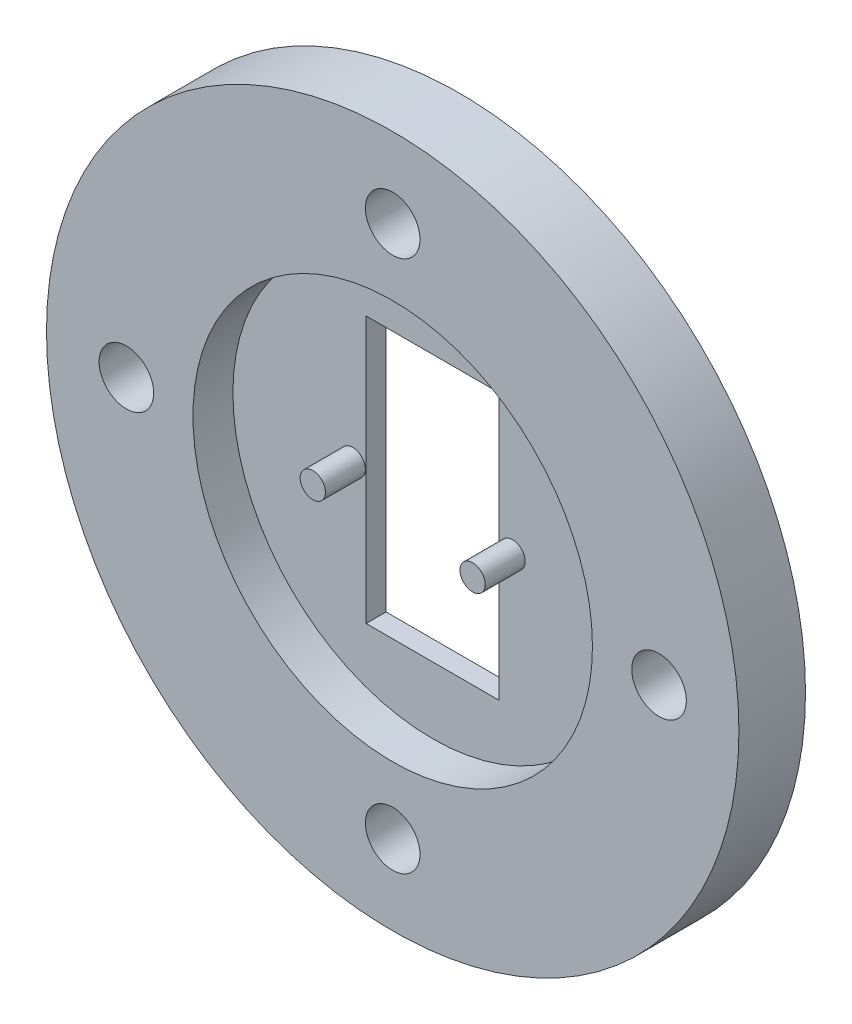
ISO-10303-21;
HEADER;
FILE_DESCRIPTION(('STEP AP214'),'2;1');
FILE_NAME('part.step','',(''),(''),'','','');
FILE_SCHEMA(('AUTOMOTIVE_DESIGN { 1 0 10303 214 1 1 1 1 }'));
ENDSEC;
DATA;
#1=APPLICATION_CONTEXT('core data for automotive mechanical design processes');
#2=APPLICATION_PROTOCOL_DEFINITION('international standard','automotive_design',2000,#1);
#3=PRODUCT_CONTEXT('',#1,'mechanical');
#4=PRODUCT('Part','Part','',(#3));
#5=PRODUCT_RELATED_PRODUCT_CATEGORY('part','',(#4));
#6=PRODUCT_DEFINITION_FORMATION('','',#4);
#7=PRODUCT_DEFINITION_CONTEXT('part definition',#1,'design');
#8=PRODUCT_DEFINITION('design','',#6,#7);
#9=PRODUCT_DEFINITION_SHAPE('','',#8);
#10=(LENGTH_UNIT() NAMED_UNIT(*) SI_UNIT(.MILLI.,.METRE.));
#11=(NAMED_UNIT(*) PLANE_ANGLE_UNIT() SI_UNIT($,.RADIAN.));
#12=(NAMED_UNIT(*) SI_UNIT($,.STERADIAN.) SOLID_ANGLE_UNIT());
#13=UNCERTAINTY_MEASURE_WITH_UNIT(LENGTH_MEASURE(1.E-05),#10,'distance_accuracy_value','');
#14=(GEOMETRIC_REPRESENTATION_CONTEXT(3) GLOBAL_UNCERTAINTY_ASSIGNED_CONTEXT((#13)) GLOBAL_UNIT_ASSIGNED_CONTEXT((#10,
#11,#12)) REPRESENTATION_CONTEXT('',''));
#15=CARTESIAN_POINT('',(0.,0.,0.));
#16=DIRECTION('',(0.,0.,1.));
#17=DIRECTION('',(1.,0.,0.));
#18=AXIS2_PLACEMENT_3D('',#15,#16,#17);
#19=CARTESIAN_POINT('',(0.,0.,2.));
#20=DIRECTION('',(0.,0.,-1.));
#21=DIRECTION('',(-1.,0.,0.));
#22=AXIS2_PLACEMENT_3D('',#19,#20,#21);
#23=PLANE('',#22);
#24=CARTESIAN_POINT('',(6.,0.,2.));
#25=DIRECTION('',(0.,0.,-1.));
#26=DIRECTION('',(-1.,0.,0.));
#27=AXIS2_PLACEMENT_3D('',#24,#25,#26);
#28=CIRCLE('',#27,0.95);
#29=CARTESIAN_POINT('',(5.05,0.,2.));
#30=VERTEX_POINT('',#29);
#31=EDGE_CURVE('E433',#30,#30,#28,.T.);
#32=ORIENTED_EDGE('',*,*,#31,.T.);
#33=EDGE_LOOP('',(#32));
#34=FACE_BOUND('',#33,.T.);
#35=CARTESIAN_POINT('',(-6.,0.,2.));
#36=DIRECTION('',(0.,0.,-1.));
#37=DIRECTION('',(-1.,0.,0.));
#38=AXIS2_PLACEMENT_3D('',#35,#36,#37);
#39=CIRCLE('',#38,0.95);
#40=CARTESIAN_POINT('',(-6.95,0.,2.));
#41=VERTEX_POINT('',#40);
#42=EDGE_CURVE('E12',#41,#41,#39,.F.);
#43=ORIENTED_EDGE('',*,*,#42,.F.);
#44=EDGE_LOOP('',(#43));
#45=FACE_BOUND('',#44,.T.);
#46=CARTESIAN_POINT('',(0.,0.,2.));
#47=DIRECTION('',(0.,0.,-1.));
#48=DIRECTION('',(-1.,0.,0.));
#49=AXIS2_PLACEMENT_3D('',#46,#47,#48);
#50=CIRCLE('',#49,15.);
#51=CARTESIAN_POINT('',(-15.,0.,2.));
#52=VERTEX_POINT('',#51);
#53=EDGE_CURVE('E128',#52,#52,#50,.F.);
#54=ORIENTED_EDGE('',*,*,#53,.T.);
#55=EDGE_LOOP('',(#54));
#56=FACE_BOUND('',#55,.T.);
#57=DIRECTION('',(1.,0.,0.));
#58=VECTOR('',#57,1.);
#59=CARTESIAN_POINT('',(-5.,-10.,2.));
#60=LINE('',#59,#58);
#61=CARTESIAN_POINT('',(-5.,-10.,2.));
#62=VERTEX_POINT('',#61);
#63=CARTESIAN_POINT('',(5.,-10.,2.));
#64=VERTEX_POINT('',#63);
#65=EDGE_CURVE('E99',#62,#64,#60,.T.);
#66=ORIENTED_EDGE('',*,*,#65,.F.);
#67=DIRECTION('',(0.,-1.,0.));
#68=VECTOR('',#67,1.);
#69=CARTESIAN_POINT('',(-5.,10.,2.));
#70=LINE('',#69,#68);
#71=CARTESIAN_POINT('',(-5.,10.,2.));
#72=VERTEX_POINT('',#71);
#73=EDGE_CURVE('E96',#72,#62,#70,.T.);
#74=ORIENTED_EDGE('',*,*,#73,.F.);
#75=DIRECTION('',(1.,0.,0.));
#76=VECTOR('',#75,1.);
#77=CARTESIAN_POINT('',(-5.,10.,2.));
#78=LINE('',#77,#76);
#79=CARTESIAN_POINT('',(5.,10.,2.));
#80=VERTEX_POINT('',#79);
#81=EDGE_CURVE('E61',#72,#80,#78,.T.);
#82=ORIENTED_EDGE('',*,*,#81,.T.);
#83=DIRECTION('',(0.,-1.,0.));
#84=VECTOR('',#83,1.);
#85=CARTESIAN_POINT('',(5.,10.,2.));
#86=LINE('',#85,#84);
#87=EDGE_CURVE('E90',#80,#64,#86,.T.);
#88=ORIENTED_EDGE('',*,*,#87,.T.);
#89=EDGE_LOOP('',(#66,#74,#82,#88));
#90=FACE_BOUND('',#89,.T.);
#91=ADVANCED_FACE('F45',(#34,#45,#56,#90),#23,.F.);
#92=CARTESIAN_POINT('',(0.,0.,5.));
#93=DIRECTION('',(0.,0.,-1.));
#94=DIRECTION('',(-1.,0.,0.));
#95=AXIS2_PLACEMENT_3D('',#92,#93,#94);
#96=CYLINDRICAL_SURFACE('',#95,26.);
#97=CARTESIAN_POINT('',(0.,0.,5.));
#98=DIRECTION('',(0.,0.,1.));
#99=DIRECTION('',(1.,0.,0.));
#100=AXIS2_PLACEMENT_3D('',#97,#98,#99);
#101=CIRCLE('',#100,26.);
#102=CARTESIAN_POINT('',(26.,0.,5.));
#103=VERTEX_POINT('',#102);
#104=EDGE_CURVE('E173',#103,#103,#101,.T.);
#105=ORIENTED_EDGE('',*,*,#104,.F.);
#106=EDGE_LOOP('',(#105));
#107=FACE_BOUND('',#106,.T.);
#108=CARTESIAN_POINT('',(0.,0.,0.));
#109=DIRECTION('',(0.,0.,1.));
#110=DIRECTION('',(1.,0.,0.));
#111=AXIS2_PLACEMENT_3D('',#108,#109,#110);
#112=CIRCLE('',#111,26.);
#113=CARTESIAN_POINT('',(26.,0.,0.));
#114=VERTEX_POINT('',#113);
#115=EDGE_CURVE('E169',#114,#114,#112,.T.);
#116=ORIENTED_EDGE('',*,*,#115,.T.);
#117=EDGE_LOOP('',(#116));
#118=FACE_BOUND('',#117,.T.);
#119=ADVANCED_FACE('F47',(#107,#118),#96,.T.);
#120=CARTESIAN_POINT('',(0.,0.,5.));
#121=DIRECTION('',(0.,0.,1.));
#122=DIRECTION('',(1.,0.,0.));
#123=AXIS2_PLACEMENT_3D('',#120,#121,#122);
#124=PLANE('',#123);
#125=CARTESIAN_POINT('',(0.,0.,5.));
#126=DIRECTION('',(0.,0.,1.));
#127=DIRECTION('',(1.,0.,0.));
#128=AXIS2_PLACEMENT_3D('',#125,#126,#127);
#129=CIRCLE('',#128,15.);
#130=CARTESIAN_POINT('',(15.,0.,5.));
#131=VERTEX_POINT('',#130);
#132=EDGE_CURVE('E119',#131,#131,#129,.T.);
#133=ORIENTED_EDGE('',*,*,#132,.F.);
#134=EDGE_LOOP('',(#133));
#135=FACE_BOUND('',#134,.T.);
#136=CARTESIAN_POINT('',(-20.,0.,5.));
#137=DIRECTION('',(0.,0.,-1.));
#138=DIRECTION('',(0.,-1.,0.));
#139=AXIS2_PLACEMENT_3D('',#136,#137,#138);
#140=CIRCLE('',#139,2.05);
#141=CARTESIAN_POINT('',(-20.,-2.05000000000007,5.));
#142=VERTEX_POINT('',#141);
#143=EDGE_CURVE('E141',#142,#142,#140,.T.);
#144=ORIENTED_EDGE('',*,*,#143,.T.);
#145=EDGE_LOOP('',(#144));
#146=FACE_BOUND('',#145,.T.);
#147=CARTESIAN_POINT('',(0.,-20.,5.));
#148=DIRECTION('',(0.,0.,-1.));
#149=DIRECTION('',(1.,0.,0.));
#150=AXIS2_PLACEMENT_3D('',#147,#148,#149);
#151=CIRCLE('',#150,2.05);
#152=CARTESIAN_POINT('',(2.05,-20.,5.));
#153=VERTEX_POINT('',#152);
#154=EDGE_CURVE('E150',#153,#153,#151,.T.);
#155=ORIENTED_EDGE('',*,*,#154,.T.);
#156=EDGE_LOOP('',(#155));
#157=FACE_BOUND('',#156,.T.);
#158=CARTESIAN_POINT('',(20.,2.09488880330588E-13,5.));
#159=DIRECTION('',(0.,0.,-1.));
#160=DIRECTION('',(0.,1.,0.));
#161=AXIS2_PLACEMENT_3D('',#158,#159,#160);
#162=CIRCLE('',#161,2.05);
#163=CARTESIAN_POINT('',(20.,2.05000000000021,5.));
#164=VERTEX_POINT('',#163);
#165=EDGE_CURVE('E158',#164,#164,#162,.T.);
#166=ORIENTED_EDGE('',*,*,#165,.T.);
#167=EDGE_LOOP('',(#166));
#168=FACE_BOUND('',#167,.T.);
#169=CARTESIAN_POINT('',(0.,20.,5.));
#170=DIRECTION('',(0.,0.,-1.));
#171=DIRECTION('',(-1.,0.,0.));
#172=AXIS2_PLACEMENT_3D('',#169,#170,#171);
#173=CIRCLE('',#172,2.05);
#174=CARTESIAN_POINT('',(-2.05,20.,5.));
#175=VERTEX_POINT('',#174);
#176=EDGE_CURVE('E165',#175,#175,#173,.T.);
#177=ORIENTED_EDGE('',*,*,#176,.T.);
#178=EDGE_LOOP('',(#177));
#179=FACE_BOUND('',#178,.T.);
#180=ORIENTED_EDGE('',*,*,#104,.T.);
#181=EDGE_LOOP('',(#180));
#182=FACE_BOUND('',#181,.T.);
#183=ADVANCED_FACE('F211',(#135,#146,#157,#168,#179,#182),#124,.T.);
#184=CARTESIAN_POINT('',(0.,0.,0.));
#185=DIRECTION('',(0.,0.,1.));
#186=DIRECTION('',(1.,0.,0.));
#187=AXIS2_PLACEMENT_3D('',#184,#185,#186);
#188=PLANE('',#187);
#189=CARTESIAN_POINT('',(0.,0.,0.));
#190=DIRECTION('',(0.,0.,-1.));
#191=DIRECTION('',(-1.,0.,0.));
#192=AXIS2_PLACEMENT_3D('',#189,#190,#191);
#193=CIRCLE('',#192,15.);
#194=CARTESIAN_POINT('',(-15.,0.,0.));
#195=VERTEX_POINT('',#194);
#196=EDGE_CURVE('E132',#195,#195,#193,.T.);
#197=ORIENTED_EDGE('',*,*,#196,.F.);
#198=EDGE_LOOP('',(#197));
#199=FACE_BOUND('',#198,.T.);
#200=CARTESIAN_POINT('',(-20.,0.,0.));
#201=DIRECTION('',(0.,0.,-1.));
#202=DIRECTION('',(0.,-1.,0.));
#203=AXIS2_PLACEMENT_3D('',#200,#201,#202);
#204=CIRCLE('',#203,2.05);
#205=CARTESIAN_POINT('',(-20.,-2.05000000000007,0.));
#206=VERTEX_POINT('',#205);
#207=EDGE_CURVE('E146',#206,#206,#204,.T.);
#208=ORIENTED_EDGE('',*,*,#207,.F.);
#209=EDGE_LOOP('',(#208));
#210=FACE_BOUND('',#209,.T.);
#211=CARTESIAN_POINT('',(0.,-20.,0.));
#212=DIRECTION('',(0.,0.,-1.));
#213=DIRECTION('',(1.,0.,0.));
#214=AXIS2_PLACEMENT_3D('',#211,#212,#213);
#215=CIRCLE('',#214,2.05);
#216=CARTESIAN_POINT('',(2.05,-20.,0.));
#217=VERTEX_POINT('',#216);
#218=EDGE_CURVE('E154',#217,#217,#215,.T.);
#219=ORIENTED_EDGE('',*,*,#218,.F.);
#220=EDGE_LOOP('',(#219));
#221=FACE_BOUND('',#220,.T.);
#222=CARTESIAN_POINT('',(20.,2.09488880330588E-13,0.));
#223=DIRECTION('',(0.,0.,-1.));
#224=DIRECTION('',(0.,1.,0.));
#225=AXIS2_PLACEMENT_3D('',#222,#223,#224);
#226=CIRCLE('',#225,2.05);
#227=CARTESIAN_POINT('',(20.,2.05000000000021,0.));
#228=VERTEX_POINT('',#227);
#229=EDGE_CURVE('E137',#228,#228,#226,.T.);
#230=ORIENTED_EDGE('',*,*,#229,.F.);
#231=EDGE_LOOP('',(#230));
#232=FACE_BOUND('',#231,.T.);
#233=CARTESIAN_POINT('',(0.,20.,0.));
#234=DIRECTION('',(0.,0.,-1.));
#235=DIRECTION('',(-1.,0.,0.));
#236=AXIS2_PLACEMENT_3D('',#233,#234,#235);
#237=CIRCLE('',#236,2.05);
#238=CARTESIAN_POINT('',(-2.05,20.,0.));
#239=VERTEX_POINT('',#238);
#240=EDGE_CURVE('E145',#239,#239,#237,.T.);
#241=ORIENTED_EDGE('',*,*,#240,.F.);
#242=EDGE_LOOP('',(#241));
#243=FACE_BOUND('',#242,.T.);
#244=ORIENTED_EDGE('',*,*,#115,.F.);
#245=EDGE_LOOP('',(#244));
#246=FACE_BOUND('',#245,.T.);
#247=ADVANCED_FACE('F240',(#199,#210,#221,#232,#243,#246),#188,.F.);
#248=CARTESIAN_POINT('',(0.,20.,5.));
#249=DIRECTION('',(0.,0.,-1.));
#250=DIRECTION('',(-1.,0.,0.));
#251=AXIS2_PLACEMENT_3D('',#248,#249,#250);
#252=CYLINDRICAL_SURFACE('',#251,2.05);
#253=ORIENTED_EDGE('',*,*,#176,.F.);
#254=EDGE_LOOP('',(#253));
#255=FACE_BOUND('',#254,.T.);
#256=ORIENTED_EDGE('',*,*,#240,.T.);
#257=EDGE_LOOP('',(#256));
#258=FACE_BOUND('',#257,.T.);
#259=ADVANCED_FACE('F236',(#255,#258),#252,.F.);
#260=CARTESIAN_POINT('',(20.,2.09488880330588E-13,5.));
#261=DIRECTION('',(0.,0.,-1.));
#262=DIRECTION('',(-1.,0.,0.));
#263=AXIS2_PLACEMENT_3D('',#260,#261,#262);
#264=CYLINDRICAL_SURFACE('',#263,2.05);
#265=ORIENTED_EDGE('',*,*,#165,.F.);
#266=EDGE_LOOP('',(#265));
#267=FACE_BOUND('',#266,.T.);
#268=ORIENTED_EDGE('',*,*,#229,.T.);
#269=EDGE_LOOP('',(#268));
#270=FACE_BOUND('',#269,.T.);
#271=ADVANCED_FACE('F232',(#267,#270),#264,.F.);
#272=CARTESIAN_POINT('',(0.,-20.,5.));
#273=DIRECTION('',(0.,0.,-1.));
#274=DIRECTION('',(-1.,0.,0.));
#275=AXIS2_PLACEMENT_3D('',#272,#273,#274);
#276=CYLINDRICAL_SURFACE('',#275,2.05);
#277=ORIENTED_EDGE('',*,*,#154,.F.);
#278=EDGE_LOOP('',(#277));
#279=FACE_BOUND('',#278,.T.);
#280=ORIENTED_EDGE('',*,*,#218,.T.);
#281=EDGE_LOOP('',(#280));
#282=FACE_BOUND('',#281,.T.);
#283=ADVANCED_FACE('F228',(#279,#282),#276,.F.);
#284=CARTESIAN_POINT('',(-20.,0.,5.));
#285=DIRECTION('',(0.,0.,-1.));
#286=DIRECTION('',(-1.,0.,0.));
#287=AXIS2_PLACEMENT_3D('',#284,#285,#286);
#288=CYLINDRICAL_SURFACE('',#287,2.05);
#289=ORIENTED_EDGE('',*,*,#143,.F.);
#290=EDGE_LOOP('',(#289));
#291=FACE_BOUND('',#290,.T.);
#292=ORIENTED_EDGE('',*,*,#207,.T.);
#293=EDGE_LOOP('',(#292));
#294=FACE_BOUND('',#293,.T.);
#295=ADVANCED_FACE('F224',(#291,#294),#288,.F.);
#296=CARTESIAN_POINT('',(0.,0.,0.5));
#297=DIRECTION('',(0.,0.,-1.));
#298=DIRECTION('',(-1.,0.,0.));
#299=AXIS2_PLACEMENT_3D('',#296,#297,#298);
#300=CYLINDRICAL_SURFACE('',#299,15.);
#301=CARTESIAN_POINT('',(0.,0.,0.5));
#302=DIRECTION('',(0.,0.,-1.));
#303=DIRECTION('',(-1.,0.,0.));
#304=AXIS2_PLACEMENT_3D('',#301,#302,#303);
#305=CIRCLE('',#304,15.);
#306=CARTESIAN_POINT('',(-15.,0.,0.5));
#307=VERTEX_POINT('',#306);
#308=EDGE_CURVE('E133',#307,#307,#305,.T.);
#309=ORIENTED_EDGE('',*,*,#308,.F.);
#310=EDGE_LOOP('',(#309));
#311=FACE_BOUND('',#310,.T.);
#312=ORIENTED_EDGE('',*,*,#196,.T.);
#313=EDGE_LOOP('',(#312));
#314=FACE_BOUND('',#313,.T.);
#315=ADVANCED_FACE('F221',(#311,#314),#300,.F.);
#316=CARTESIAN_POINT('',(0.,0.,0.5));
#317=DIRECTION('',(0.,0.,-1.));
#318=DIRECTION('',(-1.,0.,0.));
#319=AXIS2_PLACEMENT_3D('',#316,#317,#318);
#320=PLANE('',#319);
#321=DIRECTION('',(-1.,0.,0.));
#322=VECTOR('',#321,1.);
#323=CARTESIAN_POINT('',(0.,-10.,0.5));
#324=LINE('',#323,#322);
#325=CARTESIAN_POINT('',(5.,-10.,0.5));
#326=VERTEX_POINT('',#325);
#327=CARTESIAN_POINT('',(-5.,-10.,0.5));
#328=VERTEX_POINT('',#327);
#329=EDGE_CURVE('E54',#326,#328,#324,.T.);
#330=ORIENTED_EDGE('',*,*,#329,.F.);
#331=DIRECTION('',(0.,1.,0.));
#332=VECTOR('',#331,1.);
#333=CARTESIAN_POINT('',(5.,0.,0.5));
#334=LINE('',#333,#332);
#335=CARTESIAN_POINT('',(5.,10.,0.5));
#336=VERTEX_POINT('',#335);
#337=EDGE_CURVE('E92',#326,#336,#334,.T.);
#338=ORIENTED_EDGE('',*,*,#337,.T.);
#339=DIRECTION('',(-1.,0.,0.));
#340=VECTOR('',#339,1.);
#341=CARTESIAN_POINT('',(0.,10.,0.5));
#342=LINE('',#341,#340);
#343=CARTESIAN_POINT('',(-5.,10.,0.5));
#344=VERTEX_POINT('',#343);
#345=EDGE_CURVE('E182',#336,#344,#342,.T.);
#346=ORIENTED_EDGE('',*,*,#345,.T.);
#347=DIRECTION('',(0.,1.,0.));
#348=VECTOR('',#347,1.);
#349=CARTESIAN_POINT('',(-5.,0.,0.5));
#350=LINE('',#349,#348);
#351=EDGE_CURVE('E186',#328,#344,#350,.T.);
#352=ORIENTED_EDGE('',*,*,#351,.F.);
#353=EDGE_LOOP('',(#330,#338,#346,#352));
#354=FACE_BOUND('',#353,.T.);
#355=ORIENTED_EDGE('',*,*,#308,.T.);
#356=EDGE_LOOP('',(#355));
#357=FACE_BOUND('',#356,.T.);
#358=ADVANCED_FACE('F193',(#354,#357),#320,.T.);
#359=CARTESIAN_POINT('',(0.,0.,-41.9264068711929));
#360=DIRECTION('',(0.,0.,1.));
#361=DIRECTION('',(1.,0.,0.));
#362=AXIS2_PLACEMENT_3D('',#359,#360,#361);
#363=CYLINDRICAL_SURFACE('',#362,15.);
#364=ORIENTED_EDGE('',*,*,#132,.T.);
#365=EDGE_LOOP('',(#364));
#366=FACE_BOUND('',#365,.T.);
#367=ORIENTED_EDGE('',*,*,#53,.F.);
#368=EDGE_LOOP('',(#367));
#369=FACE_BOUND('',#368,.T.);
#370=ADVANCED_FACE('F217',(#366,#369),#363,.F.);
#371=CARTESIAN_POINT('',(-5.,-10.,0.));
#372=DIRECTION('',(0.,-1.,0.));
#373=DIRECTION('',(0.,0.,-1.));
#374=AXIS2_PLACEMENT_3D('',#371,#372,#373);
#375=PLANE('',#374);
#376=ORIENTED_EDGE('',*,*,#329,.T.);
#377=DIRECTION('',(0.,0.,1.));
#378=VECTOR('',#377,1.);
#379=CARTESIAN_POINT('',(-5.,-10.,0.));
#380=LINE('',#379,#378);
#381=EDGE_CURVE('E102',#328,#62,#380,.T.);
#382=ORIENTED_EDGE('',*,*,#381,.T.);
#383=ORIENTED_EDGE('',*,*,#65,.T.);
#384=DIRECTION('',(0.,0.,1.));
#385=VECTOR('',#384,1.);
#386=CARTESIAN_POINT('',(5.,-10.,0.));
#387=LINE('',#386,#385);
#388=EDGE_CURVE('E86',#326,#64,#387,.T.);
#389=ORIENTED_EDGE('',*,*,#388,.F.);
#390=EDGE_LOOP('',(#376,#382,#383,#389));
#391=FACE_BOUND('',#390,.T.);
#392=ADVANCED_FACE('F100',(#391),#375,.F.);
#393=CARTESIAN_POINT('',(-5.,10.,0.));
#394=DIRECTION('',(-1.,0.,0.));
#395=DIRECTION('',(0.,-1.,0.));
#396=AXIS2_PLACEMENT_3D('',#393,#394,#395);
#397=PLANE('',#396);
#398=ORIENTED_EDGE('',*,*,#351,.T.);
#399=DIRECTION('',(0.,0.,1.));
#400=VECTOR('',#399,1.);
#401=CARTESIAN_POINT('',(-5.,10.,0.));
#402=LINE('',#401,#400);
#403=EDGE_CURVE('E120',#344,#72,#402,.T.);
#404=ORIENTED_EDGE('',*,*,#403,.T.);
#405=ORIENTED_EDGE('',*,*,#73,.T.);
#406=ORIENTED_EDGE('',*,*,#381,.F.);
#407=EDGE_LOOP('',(#398,#404,#405,#406));
#408=FACE_BOUND('',#407,.T.);
#409=ADVANCED_FACE('F192',(#408),#397,.F.);
#410=CARTESIAN_POINT('',(-5.,10.,0.));
#411=DIRECTION('',(0.,-1.,0.));
#412=DIRECTION('',(0.,0.,-1.));
#413=AXIS2_PLACEMENT_3D('',#410,#411,#412);
#414=PLANE('',#413);
#415=DIRECTION('',(0.,0.,1.));
#416=VECTOR('',#415,1.);
#417=CARTESIAN_POINT('',(5.,10.,0.));
#418=LINE('',#417,#416);
#419=EDGE_CURVE('E68',#336,#80,#418,.T.);
#420=ORIENTED_EDGE('',*,*,#419,.T.);
#421=ORIENTED_EDGE('',*,*,#81,.F.);
#422=ORIENTED_EDGE('',*,*,#403,.F.);
#423=ORIENTED_EDGE('',*,*,#345,.F.);
#424=EDGE_LOOP('',(#420,#421,#422,#423));
#425=FACE_BOUND('',#424,.T.);
#426=ADVANCED_FACE('F195',(#425),#414,.T.);
#427=CARTESIAN_POINT('',(5.,10.,0.));
#428=DIRECTION('',(-1.,0.,0.));
#429=DIRECTION('',(0.,-1.,0.));
#430=AXIS2_PLACEMENT_3D('',#427,#428,#429);
#431=PLANE('',#430);
#432=ORIENTED_EDGE('',*,*,#388,.T.);
#433=ORIENTED_EDGE('',*,*,#87,.F.);
#434=ORIENTED_EDGE('',*,*,#419,.F.);
#435=ORIENTED_EDGE('',*,*,#337,.F.);
#436=EDGE_LOOP('',(#432,#433,#434,#435));
#437=FACE_BOUND('',#436,.T.);
#438=ADVANCED_FACE('F88',(#437),#431,.T.);
#439=CARTESIAN_POINT('',(-6.,0.,5.));
#440=DIRECTION('',(0.,0.,-1.));
#441=DIRECTION('',(-1.,0.,0.));
#442=AXIS2_PLACEMENT_3D('',#439,#440,#441);
#443=CYLINDRICAL_SURFACE('',#442,0.95);
#444=CARTESIAN_POINT('',(-6.,0.,5.));
#445=DIRECTION('',(0.,0.,1.));
#446=DIRECTION('',(1.,0.,0.));
#447=AXIS2_PLACEMENT_3D('',#444,#445,#446);
#448=CIRCLE('',#447,0.95);
#449=CARTESIAN_POINT('',(-5.05,0.,5.));
#450=VERTEX_POINT('',#449);
#451=EDGE_CURVE('E107',#450,#450,#448,.T.);
#452=ORIENTED_EDGE('',*,*,#451,.F.);
#453=EDGE_LOOP('',(#452));
#454=FACE_BOUND('',#453,.T.);
#455=ORIENTED_EDGE('',*,*,#42,.T.);
#456=EDGE_LOOP('',(#455));
#457=FACE_BOUND('',#456,.T.);
#458=ADVANCED_FACE('F202',(#454,#457),#443,.T.);
#459=CARTESIAN_POINT('',(-6.,0.,5.));
#460=DIRECTION('',(0.,0.,1.));
#461=DIRECTION('',(1.,0.,0.));
#462=AXIS2_PLACEMENT_3D('',#459,#460,#461);
#463=PLANE('',#462);
#464=ORIENTED_EDGE('',*,*,#451,.T.);
#465=EDGE_LOOP('',(#464));
#466=FACE_BOUND('',#465,.T.);
#467=ADVANCED_FACE('F329',(#466),#463,.T.);
#468=CARTESIAN_POINT('',(6.,0.,5.));
#469=DIRECTION('',(0.,0.,-1.));
#470=DIRECTION('',(-1.,0.,0.));
#471=AXIS2_PLACEMENT_3D('',#468,#469,#470);
#472=CYLINDRICAL_SURFACE('',#471,0.95);
#473=CARTESIAN_POINT('',(6.,0.,5.));
#474=DIRECTION('',(0.,0.,-1.));
#475=DIRECTION('',(-1.,0.,0.));
#476=AXIS2_PLACEMENT_3D('',#473,#474,#475);
#477=CIRCLE('',#476,0.95);
#478=CARTESIAN_POINT('',(5.05,0.,5.));
#479=VERTEX_POINT('',#478);
#480=EDGE_CURVE('E431',#479,#479,#477,.T.);
#481=ORIENTED_EDGE('',*,*,#480,.T.);
#482=EDGE_LOOP('',(#481));
#483=FACE_BOUND('',#482,.T.);
#484=ORIENTED_EDGE('',*,*,#31,.F.);
#485=EDGE_LOOP('',(#484));
#486=FACE_BOUND('',#485,.T.);
#487=ADVANCED_FACE('F339',(#483,#486),#472,.T.);
#488=CARTESIAN_POINT('',(6.,0.,5.));
#489=DIRECTION('',(0.,0.,1.));
#490=DIRECTION('',(-1.,0.,0.));
#491=AXIS2_PLACEMENT_3D('',#488,#489,#490);
#492=PLANE('',#491);
#493=ORIENTED_EDGE('',*,*,#480,.F.);
#494=EDGE_LOOP('',(#493));
#495=FACE_BOUND('',#494,.T.);
#496=ADVANCED_FACE('F357',(#495),#492,.T.);
#497=CLOSED_SHELL('',(#91,#119,#183,#247,#259,#271,#283,#295,#315,#358,#370,#392,#409,#426,#438,
#458,#467,#487,#496));
#498=MANIFOLD_SOLID_BREP('B2',#497);
#499=ADVANCED_BREP_SHAPE_REPRESENTATION('',(#18,#498),#14);
#500=SHAPE_DEFINITION_REPRESENTATION(#9,#499);
ENDSEC;
END-ISO-10303-21;
